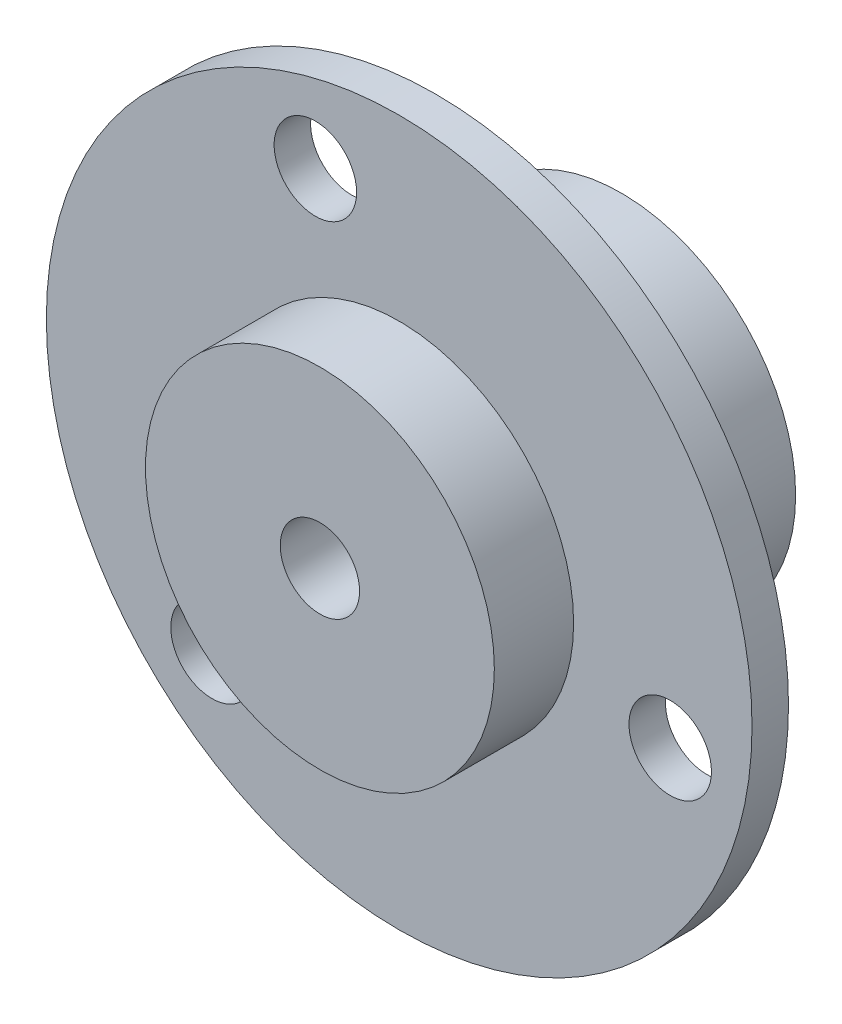
ISO-10303-21;
HEADER;
FILE_DESCRIPTION(('STEP AP214'),'2;1');
FILE_NAME('part.step','',(''),(''),'','','');
FILE_SCHEMA(('AUTOMOTIVE_DESIGN { 1 0 10303 214 1 1 1 1 }'));
ENDSEC;
DATA;
#1=APPLICATION_CONTEXT('core data for automotive mechanical design processes');
#2=APPLICATION_PROTOCOL_DEFINITION('international standard','automotive_design',2000,#1);
#3=PRODUCT_CONTEXT('',#1,'mechanical');
#4=PRODUCT('Part','Part','',(#3));
#5=PRODUCT_RELATED_PRODUCT_CATEGORY('part','',(#4));
#6=PRODUCT_DEFINITION_FORMATION('','',#4);
#7=PRODUCT_DEFINITION_CONTEXT('part definition',#1,'design');
#8=PRODUCT_DEFINITION('design','',#6,#7);
#9=PRODUCT_DEFINITION_SHAPE('','',#8);
#10=(LENGTH_UNIT() NAMED_UNIT(*) SI_UNIT(.MILLI.,.METRE.));
#11=(NAMED_UNIT(*) PLANE_ANGLE_UNIT() SI_UNIT($,.RADIAN.));
#12=(NAMED_UNIT(*) SI_UNIT($,.STERADIAN.) SOLID_ANGLE_UNIT());
#13=UNCERTAINTY_MEASURE_WITH_UNIT(LENGTH_MEASURE(1.E-05),#10,'distance_accuracy_value','');
#14=(GEOMETRIC_REPRESENTATION_CONTEXT(3) GLOBAL_UNCERTAINTY_ASSIGNED_CONTEXT((#13)) GLOBAL_UNIT_ASSIGNED_CONTEXT((#10,
#11,#12)) REPRESENTATION_CONTEXT('',''));
#15=CARTESIAN_POINT('',(0.,0.,0.));
#16=DIRECTION('',(0.,0.,1.));
#17=DIRECTION('',(1.,0.,0.));
#18=AXIS2_PLACEMENT_3D('',#15,#16,#17);
#19=CARTESIAN_POINT('',(-102.009542762628,21.1397291306103,2.3));
#20=DIRECTION('',(0.,0.,1.));
#21=DIRECTION('',(1.,0.,0.));
#22=AXIS2_PLACEMENT_3D('',#19,#20,#21);
#23=PLANE('',#22);
#24=CARTESIAN_POINT('',(-102.009542762628,21.1397291306103,2.3));
#25=DIRECTION('',(0.,0.,1.));
#26=DIRECTION('',(1.,0.,0.));
#27=AXIS2_PLACEMENT_3D('',#24,#25,#26);
#28=CIRCLE('',#27,11.);
#29=CARTESIAN_POINT('',(-91.0095427626283,21.1397291306103,2.3));
#30=VERTEX_POINT('',#29);
#31=EDGE_CURVE('E10',#30,#30,#28,.T.);
#32=ORIENTED_EDGE('',*,*,#31,.F.);
#33=EDGE_LOOP('',(#32));
#34=FACE_BOUND('',#33,.T.);
#35=CARTESIAN_POINT('',(-113.813838054202,8.220417513139,2.3));
#36=DIRECTION('',(0.,0.,1.));
#37=DIRECTION('',(1.,0.,0.));
#38=AXIS2_PLACEMENT_3D('',#35,#36,#37);
#39=CIRCLE('',#38,2.60000000000001);
#40=CARTESIAN_POINT('',(-111.213838054202,8.220417513139,2.3));
#41=VERTEX_POINT('',#40);
#42=EDGE_CURVE('E63',#41,#41,#39,.T.);
#43=ORIENTED_EDGE('',*,*,#42,.F.);
#44=EDGE_LOOP('',(#43));
#45=FACE_BOUND('',#44,.T.);
#46=CARTESIAN_POINT('',(-84.9189430567039,17.3765653430701,2.3));
#47=DIRECTION('',(0.,0.,1.));
#48=DIRECTION('',(1.,0.,0.));
#49=AXIS2_PLACEMENT_3D('',#46,#47,#48);
#50=CIRCLE('',#49,2.6);
#51=CARTESIAN_POINT('',(-82.3189430567038,17.3765653430701,2.3));
#52=VERTEX_POINT('',#51);
#53=EDGE_CURVE('E69',#52,#52,#50,.T.);
#54=ORIENTED_EDGE('',*,*,#53,.F.);
#55=EDGE_LOOP('',(#54));
#56=FACE_BOUND('',#55,.T.);
#57=CARTESIAN_POINT('',(-102.009542762628,21.1397291306103,2.3));
#58=DIRECTION('',(0.,0.,1.));
#59=DIRECTION('',(1.,0.,0.));
#60=AXIS2_PLACEMENT_3D('',#57,#58,#59);
#61=CIRCLE('',#60,22.25);
#62=CARTESIAN_POINT('',(-79.7595427626283,21.1397291306103,2.3));
#63=VERTEX_POINT('',#62);
#64=EDGE_CURVE('E45',#63,#63,#61,.T.);
#65=ORIENTED_EDGE('',*,*,#64,.T.);
#66=EDGE_LOOP('',(#65));
#67=FACE_BOUND('',#66,.T.);
#68=CARTESIAN_POINT('',(-107.295847176979,37.8222045356219,2.3));
#69=DIRECTION('',(0.,0.,1.));
#70=DIRECTION('',(1.,0.,0.));
#71=AXIS2_PLACEMENT_3D('',#68,#69,#70);
#72=CIRCLE('',#71,2.60000000000001);
#73=CARTESIAN_POINT('',(-104.695847176979,37.8222045356219,2.3));
#74=VERTEX_POINT('',#73);
#75=EDGE_CURVE('E56',#74,#74,#72,.T.);
#76=ORIENTED_EDGE('',*,*,#75,.F.);
#77=EDGE_LOOP('',(#76));
#78=FACE_BOUND('',#77,.T.);
#79=ADVANCED_FACE('F37',(#34,#45,#56,#67,#78),#23,.T.);
#80=CARTESIAN_POINT('',(-102.009542762628,21.1397291306103,0.));
#81=DIRECTION('',(0.,0.,1.));
#82=DIRECTION('',(1.,0.,0.));
#83=AXIS2_PLACEMENT_3D('',#80,#81,#82);
#84=PLANE('',#83);
#85=CARTESIAN_POINT('',(-102.009542762628,21.1397291306103,0.));
#86=DIRECTION('',(0.,0.,1.));
#87=DIRECTION('',(1.,0.,0.));
#88=AXIS2_PLACEMENT_3D('',#85,#86,#87);
#89=CIRCLE('',#88,11.);
#90=CARTESIAN_POINT('',(-91.0095427626283,21.1397291306103,0.));
#91=VERTEX_POINT('',#90);
#92=EDGE_CURVE('E41',#91,#91,#89,.T.);
#93=ORIENTED_EDGE('',*,*,#92,.T.);
#94=EDGE_LOOP('',(#93));
#95=FACE_BOUND('',#94,.T.);
#96=CARTESIAN_POINT('',(-102.009542762628,21.1397291306103,0.));
#97=DIRECTION('',(0.,0.,1.));
#98=DIRECTION('',(1.,0.,0.));
#99=AXIS2_PLACEMENT_3D('',#96,#97,#98);
#100=CIRCLE('',#99,22.25);
#101=CARTESIAN_POINT('',(-79.7595427626283,21.1397291306103,0.));
#102=VERTEX_POINT('',#101);
#103=EDGE_CURVE('E50',#102,#102,#100,.T.);
#104=ORIENTED_EDGE('',*,*,#103,.F.);
#105=EDGE_LOOP('',(#104));
#106=FACE_BOUND('',#105,.T.);
#107=CARTESIAN_POINT('',(-84.9189430567039,17.3765653430701,0.));
#108=DIRECTION('',(0.,0.,1.));
#109=DIRECTION('',(1.,0.,0.));
#110=AXIS2_PLACEMENT_3D('',#107,#108,#109);
#111=CIRCLE('',#110,2.6);
#112=CARTESIAN_POINT('',(-82.3189430567038,17.3765653430701,0.));
#113=VERTEX_POINT('',#112);
#114=EDGE_CURVE('E66',#113,#113,#111,.T.);
#115=ORIENTED_EDGE('',*,*,#114,.T.);
#116=EDGE_LOOP('',(#115));
#117=FACE_BOUND('',#116,.T.);
#118=CARTESIAN_POINT('',(-113.813838054202,8.220417513139,0.));
#119=DIRECTION('',(0.,0.,1.));
#120=DIRECTION('',(1.,0.,0.));
#121=AXIS2_PLACEMENT_3D('',#118,#119,#120);
#122=CIRCLE('',#121,2.60000000000001);
#123=CARTESIAN_POINT('',(-111.213838054202,8.220417513139,0.));
#124=VERTEX_POINT('',#123);
#125=EDGE_CURVE('E59',#124,#124,#122,.T.);
#126=ORIENTED_EDGE('',*,*,#125,.T.);
#127=EDGE_LOOP('',(#126));
#128=FACE_BOUND('',#127,.T.);
#129=CARTESIAN_POINT('',(-107.295847176979,37.8222045356219,0.));
#130=DIRECTION('',(0.,0.,1.));
#131=DIRECTION('',(1.,0.,0.));
#132=AXIS2_PLACEMENT_3D('',#129,#130,#131);
#133=CIRCLE('',#132,2.60000000000001);
#134=CARTESIAN_POINT('',(-104.695847176979,37.8222045356219,0.));
#135=VERTEX_POINT('',#134);
#136=EDGE_CURVE('E60',#135,#135,#133,.T.);
#137=ORIENTED_EDGE('',*,*,#136,.T.);
#138=EDGE_LOOP('',(#137));
#139=FACE_BOUND('',#138,.T.);
#140=ADVANCED_FACE('F77',(#95,#106,#117,#128,#139),#84,.F.);
#141=CARTESIAN_POINT('',(-102.009542762628,21.1397291306103,2.3));
#142=DIRECTION('',(0.,0.,-1.));
#143=DIRECTION('',(-1.,0.,0.));
#144=AXIS2_PLACEMENT_3D('',#141,#142,#143);
#145=CYLINDRICAL_SURFACE('',#144,22.25);
#146=ORIENTED_EDGE('',*,*,#64,.F.);
#147=EDGE_LOOP('',(#146));
#148=FACE_BOUND('',#147,.T.);
#149=ORIENTED_EDGE('',*,*,#103,.T.);
#150=EDGE_LOOP('',(#149));
#151=FACE_BOUND('',#150,.T.);
#152=ADVANCED_FACE('F39',(#148,#151),#145,.T.);
#153=CARTESIAN_POINT('',(-84.9189430567039,17.3765653430701,2.3));
#154=DIRECTION('',(0.,0.,-1.));
#155=DIRECTION('',(-1.,0.,0.));
#156=AXIS2_PLACEMENT_3D('',#153,#154,#155);
#157=CYLINDRICAL_SURFACE('',#156,2.6);
#158=ORIENTED_EDGE('',*,*,#53,.T.);
#159=EDGE_LOOP('',(#158));
#160=FACE_BOUND('',#159,.T.);
#161=ORIENTED_EDGE('',*,*,#114,.F.);
#162=EDGE_LOOP('',(#161));
#163=FACE_BOUND('',#162,.T.);
#164=ADVANCED_FACE('F101',(#160,#163),#157,.F.);
#165=CARTESIAN_POINT('',(-113.813838054202,8.220417513139,2.3));
#166=DIRECTION('',(0.,0.,-1.));
#167=DIRECTION('',(-1.,0.,0.));
#168=AXIS2_PLACEMENT_3D('',#165,#166,#167);
#169=CYLINDRICAL_SURFACE('',#168,2.60000000000001);
#170=ORIENTED_EDGE('',*,*,#42,.T.);
#171=EDGE_LOOP('',(#170));
#172=FACE_BOUND('',#171,.T.);
#173=ORIENTED_EDGE('',*,*,#125,.F.);
#174=EDGE_LOOP('',(#173));
#175=FACE_BOUND('',#174,.T.);
#176=ADVANCED_FACE('F90',(#172,#175),#169,.F.);
#177=CARTESIAN_POINT('',(-107.295847176979,37.8222045356219,2.3));
#178=DIRECTION('',(0.,0.,-1.));
#179=DIRECTION('',(-1.,0.,0.));
#180=AXIS2_PLACEMENT_3D('',#177,#178,#179);
#181=CYLINDRICAL_SURFACE('',#180,2.60000000000001);
#182=ORIENTED_EDGE('',*,*,#75,.T.);
#183=EDGE_LOOP('',(#182));
#184=FACE_BOUND('',#183,.T.);
#185=ORIENTED_EDGE('',*,*,#136,.F.);
#186=EDGE_LOOP('',(#185));
#187=FACE_BOUND('',#186,.T.);
#188=ADVANCED_FACE('F87',(#184,#187),#181,.F.);
#189=CARTESIAN_POINT('',(-102.009542762628,21.1397291306103,-11.7));
#190=DIRECTION('',(0.,0.,1.));
#191=DIRECTION('',(1.,0.,0.));
#192=AXIS2_PLACEMENT_3D('',#189,#190,#191);
#193=CYLINDRICAL_SURFACE('',#192,11.);
#194=CARTESIAN_POINT('',(-102.009542762628,21.1397291306103,-11.7));
#195=DIRECTION('',(0.,0.,1.));
#196=DIRECTION('',(1.,0.,0.));
#197=AXIS2_PLACEMENT_3D('',#194,#195,#196);
#198=CIRCLE('',#197,11.);
#199=CARTESIAN_POINT('',(-91.0095427626283,21.1397291306103,-11.7));
#200=VERTEX_POINT('',#199);
#201=EDGE_CURVE('E54',#200,#200,#198,.T.);
#202=ORIENTED_EDGE('',*,*,#201,.T.);
#203=EDGE_LOOP('',(#202));
#204=FACE_BOUND('',#203,.T.);
#205=ORIENTED_EDGE('',*,*,#92,.F.);
#206=EDGE_LOOP('',(#205));
#207=FACE_BOUND('',#206,.T.);
#208=ADVANCED_FACE('F89',(#204,#207),#193,.T.);
#209=CARTESIAN_POINT('',(-102.009542762628,21.1397291306103,-11.7));
#210=DIRECTION('',(0.,0.,1.));
#211=DIRECTION('',(1.,0.,0.));
#212=AXIS2_PLACEMENT_3D('',#209,#210,#211);
#213=PLANE('',#212);
#214=CARTESIAN_POINT('',(-102.009542762628,21.1397291306103,-11.7));
#215=DIRECTION('',(0.,0.,1.));
#216=DIRECTION('',(1.,0.,0.));
#217=AXIS2_PLACEMENT_3D('',#214,#215,#216);
#218=CIRCLE('',#217,2.50000000000001);
#219=CARTESIAN_POINT('',(-99.5095427626283,21.1397291306103,-11.7));
#220=VERTEX_POINT('',#219);
#221=EDGE_CURVE('E127',#220,#220,#218,.T.);
#222=ORIENTED_EDGE('',*,*,#221,.T.);
#223=EDGE_LOOP('',(#222));
#224=FACE_BOUND('',#223,.T.);
#225=ORIENTED_EDGE('',*,*,#201,.F.);
#226=EDGE_LOOP('',(#225));
#227=FACE_BOUND('',#226,.T.);
#228=ADVANCED_FACE('F97',(#224,#227),#213,.F.);
#229=CARTESIAN_POINT('',(-102.009542762628,21.1397291306103,2.3));
#230=DIRECTION('',(0.,0.,-1.));
#231=DIRECTION('',(-1.,0.,0.));
#232=AXIS2_PLACEMENT_3D('',#229,#230,#231);
#233=CYLINDRICAL_SURFACE('',#232,2.50000000000001);
#234=ORIENTED_EDGE('',*,*,#221,.F.);
#235=EDGE_LOOP('',(#234));
#236=FACE_BOUND('',#235,.T.);
#237=CARTESIAN_POINT('',(-102.009542762628,21.1397291306103,7.3));
#238=DIRECTION('',(0.,0.,1.));
#239=DIRECTION('',(1.,0.,0.));
#240=AXIS2_PLACEMENT_3D('',#237,#238,#239);
#241=CIRCLE('',#240,2.50000000000001);
#242=CARTESIAN_POINT('',(-99.5095427626283,21.1397291306103,7.3));
#243=VERTEX_POINT('',#242);
#244=EDGE_CURVE('E130',#243,#243,#241,.T.);
#245=ORIENTED_EDGE('',*,*,#244,.T.);
#246=EDGE_LOOP('',(#245));
#247=FACE_BOUND('',#246,.T.);
#248=ADVANCED_FACE('F114',(#236,#247),#233,.F.);
#249=ORIENTED_EDGE('',*,*,#31,.T.);
#250=EDGE_LOOP('',(#249));
#251=FACE_BOUND('',#250,.T.);
#252=CARTESIAN_POINT('',(-102.009542762628,21.1397291306103,7.3));
#253=DIRECTION('',(0.,0.,1.));
#254=DIRECTION('',(1.,0.,0.));
#255=AXIS2_PLACEMENT_3D('',#252,#253,#254);
#256=CIRCLE('',#255,11.);
#257=CARTESIAN_POINT('',(-91.0095427626283,21.1397291306103,7.3));
#258=VERTEX_POINT('',#257);
#259=EDGE_CURVE('E132',#258,#258,#256,.T.);
#260=ORIENTED_EDGE('',*,*,#259,.F.);
#261=EDGE_LOOP('',(#260));
#262=FACE_BOUND('',#261,.T.);
#263=ADVANCED_FACE('F100',(#251,#262),#193,.T.);
#264=CARTESIAN_POINT('',(-102.009542762628,21.1397291306103,7.3));
#265=DIRECTION('',(0.,0.,1.));
#266=DIRECTION('',(1.,0.,0.));
#267=AXIS2_PLACEMENT_3D('',#264,#265,#266);
#268=PLANE('',#267);
#269=ORIENTED_EDGE('',*,*,#259,.T.);
#270=EDGE_LOOP('',(#269));
#271=FACE_BOUND('',#270,.T.);
#272=ORIENTED_EDGE('',*,*,#244,.F.);
#273=EDGE_LOOP('',(#272));
#274=FACE_BOUND('',#273,.T.);
#275=ADVANCED_FACE('F121',(#271,#274),#268,.T.);
#276=CLOSED_SHELL('',(#79,#140,#152,#164,#176,#188,#208,#228,#248,#263,#275));
#277=MANIFOLD_SOLID_BREP('B2',#276);
#278=ADVANCED_BREP_SHAPE_REPRESENTATION('',(#18,#277),#14);
#279=SHAPE_DEFINITION_REPRESENTATION(#9,#278);
ENDSEC;
END-ISO-10303-21;
